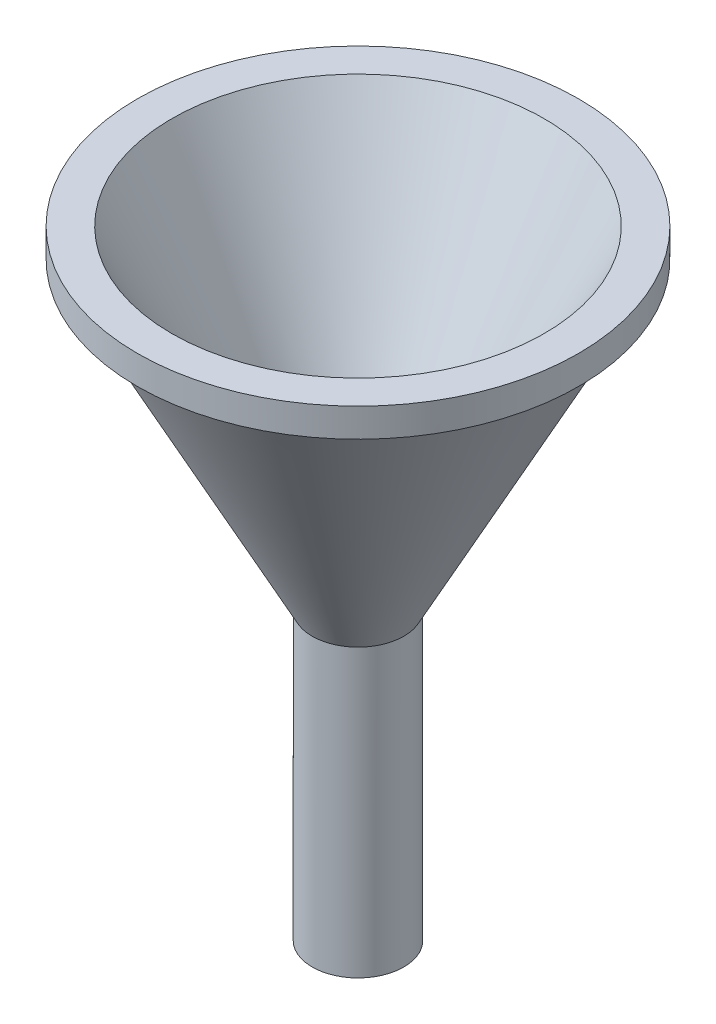
ISO-10303-21;
HEADER;
FILE_DESCRIPTION(('STEP AP214'),'2;1');
FILE_NAME('part.step','',(''),(''),'','','');
FILE_SCHEMA(('AUTOMOTIVE_DESIGN { 1 0 10303 214 1 1 1 1 }'));
ENDSEC;
DATA;
#1=APPLICATION_CONTEXT('core data for automotive mechanical design processes');
#2=APPLICATION_PROTOCOL_DEFINITION('international standard','automotive_design',2000,#1);
#3=PRODUCT_CONTEXT('',#1,'mechanical');
#4=PRODUCT('Part','Part','',(#3));
#5=PRODUCT_RELATED_PRODUCT_CATEGORY('part','',(#4));
#6=PRODUCT_DEFINITION_FORMATION('','',#4);
#7=PRODUCT_DEFINITION_CONTEXT('part definition',#1,'design');
#8=PRODUCT_DEFINITION('design','',#6,#7);
#9=PRODUCT_DEFINITION_SHAPE('','',#8);
#10=(LENGTH_UNIT() NAMED_UNIT(*) SI_UNIT(.MILLI.,.METRE.));
#11=(NAMED_UNIT(*) PLANE_ANGLE_UNIT() SI_UNIT($,.RADIAN.));
#12=(NAMED_UNIT(*) SI_UNIT($,.STERADIAN.) SOLID_ANGLE_UNIT());
#13=UNCERTAINTY_MEASURE_WITH_UNIT(LENGTH_MEASURE(1.E-05),#10,'distance_accuracy_value','');
#14=(GEOMETRIC_REPRESENTATION_CONTEXT(3) GLOBAL_UNCERTAINTY_ASSIGNED_CONTEXT((#13)) GLOBAL_UNIT_ASSIGNED_CONTEXT((#10,
#11,#12)) REPRESENTATION_CONTEXT('',''));
#15=CARTESIAN_POINT('',(0.,0.,0.));
#16=DIRECTION('',(0.,0.,1.));
#17=DIRECTION('',(1.,0.,0.));
#18=AXIS2_PLACEMENT_3D('',#15,#16,#17);
#19=CARTESIAN_POINT('',(0.,50.,0.));
#20=DIRECTION('',(0.,1.,0.));
#21=DIRECTION('',(0.,0.,1.));
#22=AXIS2_PLACEMENT_3D('',#19,#20,#21);
#23=CONICAL_SURFACE('',#22,8.00000000000001,0.484122563024974);
#24=CARTESIAN_POINT('',(0.,50.,0.));
#25=DIRECTION('',(0.,-1.,0.));
#26=DIRECTION('',(0.,0.,-1.));
#27=AXIS2_PLACEMENT_3D('',#24,#25,#26);
#28=CIRCLE('',#27,8.00000000000001);
#29=CARTESIAN_POINT('',(0.,50.,8.00000000000001));
#30=VERTEX_POINT('',#29);
#31=EDGE_CURVE('E65',#30,#30,#28,.T.);
#32=CARTESIAN_POINT('',(0.,103.,0.));
#33=DIRECTION('',(0.,1.,0.));
#34=DIRECTION('',(0.,0.,1.));
#35=AXIS2_PLACEMENT_3D('',#32,#33,#34);
#36=CIRCLE('',#35,35.8706896551724);
#37=CARTESIAN_POINT('',(0.,103.,35.8706896551724));
#38=VERTEX_POINT('',#37);
#39=EDGE_CURVE('E45',#38,#38,#36,.F.);
#40=CARTESIAN_POINT('',(0.,50.,8.00000000000001));
#41=CARTESIAN_POINT('',(0.,50.5520833333333,8.29031968390806));
#42=CARTESIAN_POINT('',(0.,51.1041666666667,8.5806393678161));
#43=CARTESIAN_POINT('',(0.,52.2083333333333,9.1612787356322));
#44=CARTESIAN_POINT('',(0.,52.7604166666667,9.45159841954024));
#45=CARTESIAN_POINT('',(0.,53.8645833333333,10.0322377873563));
#46=CARTESIAN_POINT('',(0.,54.4166666666667,10.3225574712644));
#47=CARTESIAN_POINT('',(0.,55.5208333333333,10.9031968390805));
#48=CARTESIAN_POINT('',(0.,56.0729166666667,11.1935165229885));
#49=CARTESIAN_POINT('',(0.,57.1770833333333,11.7741558908046));
#50=CARTESIAN_POINT('',(0.,57.7291666666667,12.0644755747127));
#51=CARTESIAN_POINT('',(0.,58.8333333333333,12.6451149425287));
#52=CARTESIAN_POINT('',(0.,59.3854166666667,12.9354346264368));
#53=CARTESIAN_POINT('',(0.,60.4895833333333,13.5160739942529));
#54=CARTESIAN_POINT('',(0.,61.0416666666667,13.8063936781609));
#55=CARTESIAN_POINT('',(0.,62.1458333333333,14.387033045977));
#56=CARTESIAN_POINT('',(0.,62.6979166666667,14.6773527298851));
#57=CARTESIAN_POINT('',(0.,63.8020833333333,15.2579920977012));
#58=CARTESIAN_POINT('',(0.,64.3541666666667,15.5483117816092));
#59=CARTESIAN_POINT('',(0.,65.4583333333333,16.1289511494253));
#60=CARTESIAN_POINT('',(0.,66.0104166666667,16.4192708333333));
#61=CARTESIAN_POINT('',(0.,67.1145833333333,16.9999102011494));
#62=CARTESIAN_POINT('',(0.,67.6666666666667,17.2902298850575));
#63=CARTESIAN_POINT('',(0.,68.7708333333333,17.8708692528736));
#64=CARTESIAN_POINT('',(0.,69.3229166666667,18.1611889367816));
#65=CARTESIAN_POINT('',(0.,70.4270833333333,18.7418283045977));
#66=CARTESIAN_POINT('',(0.,70.9791666666667,19.0321479885058));
#67=CARTESIAN_POINT('',(0.,72.0833333333333,19.6127873563218));
#68=CARTESIAN_POINT('',(0.,72.6354166666667,19.9031070402299));
#69=CARTESIAN_POINT('',(0.,73.7395833333333,20.483746408046));
#70=CARTESIAN_POINT('',(0.,74.2916666666667,20.774066091954));
#71=CARTESIAN_POINT('',(0.,75.3958333333333,21.3547054597701));
#72=CARTESIAN_POINT('',(0.,75.9479166666667,21.6450251436782));
#73=CARTESIAN_POINT('',(0.,77.0520833333333,22.2256645114943));
#74=CARTESIAN_POINT('',(0.,77.6041666666667,22.5159841954023));
#75=CARTESIAN_POINT('',(0.,78.7083333333333,23.0966235632184));
#76=CARTESIAN_POINT('',(0.,79.2604166666667,23.3869432471264));
#77=CARTESIAN_POINT('',(0.,80.3645833333333,23.9675826149425));
#78=CARTESIAN_POINT('',(0.,80.9166666666667,24.2579022988506));
#79=CARTESIAN_POINT('',(0.,82.0208333333333,24.8385416666667));
#80=CARTESIAN_POINT('',(0.,82.5729166666667,25.1288613505747));
#81=CARTESIAN_POINT('',(0.,83.6770833333333,25.7095007183908));
#82=CARTESIAN_POINT('',(0.,84.2291666666667,25.9998204022989));
#83=CARTESIAN_POINT('',(0.,85.3333333333333,26.5804597701149));
#84=CARTESIAN_POINT('',(0.,85.8854166666667,26.870779454023));
#85=CARTESIAN_POINT('',(0.,86.9895833333333,27.4514188218391));
#86=CARTESIAN_POINT('',(0.,87.5416666666667,27.7417385057471));
#87=CARTESIAN_POINT('',(0.,88.6458333333333,28.3223778735632));
#88=CARTESIAN_POINT('',(0.,89.1979166666667,28.6126975574713));
#89=CARTESIAN_POINT('',(0.,90.3020833333333,29.1933369252874));
#90=CARTESIAN_POINT('',(0.,90.8541666666667,29.4836566091954));
#91=CARTESIAN_POINT('',(0.,91.9583333333333,30.0642959770115));
#92=CARTESIAN_POINT('',(0.,92.5104166666667,30.3546156609195));
#93=CARTESIAN_POINT('',(0.,93.6145833333333,30.9352550287356));
#94=CARTESIAN_POINT('',(0.,94.1666666666667,31.2255747126437));
#95=CARTESIAN_POINT('',(0.,95.2708333333333,31.8062140804598));
#96=CARTESIAN_POINT('',(0.,95.8229166666667,32.0965337643678));
#97=CARTESIAN_POINT('',(0.,96.9270833333333,32.6771731321839));
#98=CARTESIAN_POINT('',(0.,97.4791666666667,32.9674928160919));
#99=CARTESIAN_POINT('',(0.,98.5833333333333,33.548132183908));
#100=CARTESIAN_POINT('',(0.,99.1354166666667,33.8384518678161));
#101=CARTESIAN_POINT('',(0.,100.239583333333,34.4190912356322));
#102=CARTESIAN_POINT('',(0.,100.791666666667,34.7094109195402));
#103=CARTESIAN_POINT('',(0.,101.895833333333,35.2900502873563));
#104=CARTESIAN_POINT('',(0.,102.447916666667,35.5803699712644));
#105=CARTESIAN_POINT('',(0.,103.,35.8706896551724));
#106=B_SPLINE_CURVE_WITH_KNOTS('',3,(#40,#41,#42,#43,#44,#45,#46,#47,#48,#49,#50,#51,#52,#53,
#54,#55,#56,#57,#58,#59,#60,#61,#62,#63,#64,#65,#66,#67,#68,#69,#70,#71,#72,#73,#74,#75,#76,#77,
#78,#79,#80,#81,#82,#83,#84,#85,#86,#87,#88,#89,#90,#91,#92,#93,#94,#95,#96,#97,#98,#99,#100,
#101,#102,#103,#104,#105),.UNSPECIFIED.,.F.,.F.,(4,2,2,2,2,2,2,2,2,2,2,2,2,2,2,2,2,2,2,2,2,2,2,
2,2,2,2,2,2,2,2,2,4),(0.,1.87129199546201,3.74258399092403,5.61387598638604,7.48516798184805,
9.35645997731007,11.2277519727721,13.0990439682341,14.9703359636961,16.8416279591581,
18.7129199546201,20.5842119500821,22.4555039455442,24.3267959410062,26.1980879364682,
28.0693799319302,29.9406719273922,31.8119639228542,33.6832559183162,35.5545479137783,
37.4258399092403,39.2971319047023,41.1684239001643,43.0397158956263,44.9110078910884,
46.7822998865504,48.6535918820124,50.5248838774744,52.3961758729364,54.2674678683984,
56.1387598638605,58.0100518593225,59.8813438547845),.UNSPECIFIED.);
#107=EDGE_CURVE('BSEAM41',#30,#38,#106,.T.);
#108=ORIENTED_EDGE('',*,*,#31,.F.);
#109=ORIENTED_EDGE('',*,*,#39,.T.);
#110=ORIENTED_EDGE('',*,*,#107,.T.);
#111=ORIENTED_EDGE('',*,*,#107,.F.);
#112=EDGE_LOOP('',(#108,#110,#109,#111));
#113=FACE_BOUND('',#112,.T.);
#114=ADVANCED_FACE('F41',(#113),#23,.T.);
#115=CARTESIAN_POINT('',(8.,0.,0.));
#116=DIRECTION('',(0.,-1.,0.));
#117=DIRECTION('',(0.,0.,-1.));
#118=AXIS2_PLACEMENT_3D('',#115,#116,#117);
#119=PLANE('',#118);
#120=CARTESIAN_POINT('',(0.,0.,0.));
#121=DIRECTION('',(0.,-1.,0.));
#122=DIRECTION('',(0.,0.,-1.));
#123=AXIS2_PLACEMENT_3D('',#120,#121,#122);
#124=CIRCLE('',#123,8.);
#125=CARTESIAN_POINT('',(0.,0.,-8.));
#126=VERTEX_POINT('',#125);
#127=EDGE_CURVE('E69',#126,#126,#124,.T.);
#128=ORIENTED_EDGE('',*,*,#127,.T.);
#129=EDGE_LOOP('',(#128));
#130=FACE_BOUND('',#129,.T.);
#131=CARTESIAN_POINT('',(0.,0.,0.));
#132=DIRECTION('',(0.,-1.,0.));
#133=DIRECTION('',(0.,0.,-1.));
#134=AXIS2_PLACEMENT_3D('',#131,#132,#133);
#135=CIRCLE('',#134,2.);
#136=CARTESIAN_POINT('',(0.,0.,-2.));
#137=VERTEX_POINT('',#136);
#138=EDGE_CURVE('E10',#137,#137,#135,.T.);
#139=ORIENTED_EDGE('',*,*,#138,.F.);
#140=EDGE_LOOP('',(#139));
#141=FACE_BOUND('',#140,.T.);
#142=ADVANCED_FACE('F43',(#130,#141),#119,.T.);
#143=CARTESIAN_POINT('',(0.,0.,0.));
#144=DIRECTION('',(0.,-1.,0.));
#145=DIRECTION('',(0.,0.,-1.));
#146=AXIS2_PLACEMENT_3D('',#143,#144,#145);
#147=CYLINDRICAL_SURFACE('',#146,2.00000000000001);
#148=ORIENTED_EDGE('',*,*,#138,.T.);
#149=EDGE_LOOP('',(#148));
#150=FACE_BOUND('',#149,.T.);
#151=CARTESIAN_POINT('',(0.,50.,0.));
#152=DIRECTION('',(0.,-1.,0.));
#153=DIRECTION('',(0.,0.,-1.));
#154=AXIS2_PLACEMENT_3D('',#151,#152,#153);
#155=CIRCLE('',#154,2.00000000000001);
#156=CARTESIAN_POINT('',(0.,50.,2.00000000000002));
#157=VERTEX_POINT('',#156);
#158=EDGE_CURVE('E50',#157,#157,#155,.T.);
#159=ORIENTED_EDGE('',*,*,#158,.F.);
#160=EDGE_LOOP('',(#159));
#161=FACE_BOUND('',#160,.T.);
#162=ADVANCED_FACE('F99',(#150,#161),#147,.F.);
#163=CARTESIAN_POINT('',(0.,108.,0.));
#164=DIRECTION('',(0.,1.,0.));
#165=DIRECTION('',(0.,0.,1.));
#166=AXIS2_PLACEMENT_3D('',#163,#164,#165);
#167=CONICAL_SURFACE('',#166,32.5,0.484122563024974);
#168=CARTESIAN_POINT('',(0.,108.,0.));
#169=DIRECTION('',(0.,-1.,0.));
#170=DIRECTION('',(0.,0.,-1.));
#171=AXIS2_PLACEMENT_3D('',#168,#169,#170);
#172=CIRCLE('',#171,32.5);
#173=CARTESIAN_POINT('',(0.,108.,32.5));
#174=VERTEX_POINT('',#173);
#175=EDGE_CURVE('E55',#174,#174,#172,.T.);
#176=CARTESIAN_POINT('',(0.,50.,2.00000000000002));
#177=CARTESIAN_POINT('',(0.,50.6041666666667,2.31770833333335));
#178=CARTESIAN_POINT('',(0.,51.2083333333333,2.63541666666669));
#179=CARTESIAN_POINT('',(0.,52.4166666666667,3.27083333333335));
#180=CARTESIAN_POINT('',(0.,53.0208333333333,3.58854166666668));
#181=CARTESIAN_POINT('',(0.,54.2291666666667,4.22395833333335));
#182=CARTESIAN_POINT('',(0.,54.8333333333333,4.54166666666668));
#183=CARTESIAN_POINT('',(0.,56.0416666666667,5.17708333333335));
#184=CARTESIAN_POINT('',(0.,56.6458333333333,5.49479166666668));
#185=CARTESIAN_POINT('',(0.,57.8541666666667,6.13020833333335));
#186=CARTESIAN_POINT('',(0.,58.4583333333333,6.44791666666668));
#187=CARTESIAN_POINT('',(0.,59.6666666666667,7.08333333333335));
#188=CARTESIAN_POINT('',(0.,60.2708333333333,7.40104166666668));
#189=CARTESIAN_POINT('',(0.,61.4791666666667,8.03645833333335));
#190=CARTESIAN_POINT('',(0.,62.0833333333333,8.35416666666668));
#191=CARTESIAN_POINT('',(0.,63.2916666666667,8.98958333333335));
#192=CARTESIAN_POINT('',(0.,63.8958333333333,9.30729166666668));
#193=CARTESIAN_POINT('',(0.,65.1041666666667,9.94270833333335));
#194=CARTESIAN_POINT('',(0.,65.7083333333333,10.2604166666667));
#195=CARTESIAN_POINT('',(0.,66.9166666666667,10.8958333333333));
#196=CARTESIAN_POINT('',(0.,67.5208333333333,11.2135416666667));
#197=CARTESIAN_POINT('',(0.,68.7291666666667,11.8489583333333));
#198=CARTESIAN_POINT('',(0.,69.3333333333333,12.1666666666667));
#199=CARTESIAN_POINT('',(0.,70.5416666666667,12.8020833333333));
#200=CARTESIAN_POINT('',(0.,71.1458333333333,13.1197916666667));
#201=CARTESIAN_POINT('',(0.,72.3541666666667,13.7552083333333));
#202=CARTESIAN_POINT('',(0.,72.9583333333333,14.0729166666667));
#203=CARTESIAN_POINT('',(0.,74.1666666666667,14.7083333333333));
#204=CARTESIAN_POINT('',(0.,74.7708333333333,15.0260416666667));
#205=CARTESIAN_POINT('',(0.,75.9791666666667,15.6614583333333));
#206=CARTESIAN_POINT('',(0.,76.5833333333334,15.9791666666667));
#207=CARTESIAN_POINT('',(0.,77.7916666666667,16.6145833333333));
#208=CARTESIAN_POINT('',(0.,78.3958333333333,16.9322916666667));
#209=CARTESIAN_POINT('',(0.,79.6041666666667,17.5677083333333));
#210=CARTESIAN_POINT('',(0.,80.2083333333333,17.8854166666667));
#211=CARTESIAN_POINT('',(0.,81.4166666666667,18.5208333333333));
#212=CARTESIAN_POINT('',(0.,82.0208333333333,18.8385416666667));
#213=CARTESIAN_POINT('',(0.,83.2291666666667,19.4739583333333));
#214=CARTESIAN_POINT('',(0.,83.8333333333333,19.7916666666667));
#215=CARTESIAN_POINT('',(0.,85.0416666666667,20.4270833333333));
#216=CARTESIAN_POINT('',(0.,85.6458333333333,20.7447916666667));
#217=CARTESIAN_POINT('',(0.,86.8541666666667,21.3802083333333));
#218=CARTESIAN_POINT('',(0.,87.4583333333333,21.6979166666667));
#219=CARTESIAN_POINT('',(0.,88.6666666666667,22.3333333333333));
#220=CARTESIAN_POINT('',(0.,89.2708333333333,22.6510416666667));
#221=CARTESIAN_POINT('',(0.,90.4791666666667,23.2864583333333));
#222=CARTESIAN_POINT('',(0.,91.0833333333333,23.6041666666667));
#223=CARTESIAN_POINT('',(0.,92.2916666666667,24.2395833333333));
#224=CARTESIAN_POINT('',(0.,92.8958333333333,24.5572916666667));
#225=CARTESIAN_POINT('',(0.,94.1041666666667,25.1927083333333));
#226=CARTESIAN_POINT('',(0.,94.7083333333333,25.5104166666667));
#227=CARTESIAN_POINT('',(0.,95.9166666666667,26.1458333333333));
#228=CARTESIAN_POINT('',(0.,96.5208333333333,26.4635416666667));
#229=CARTESIAN_POINT('',(0.,97.7291666666667,27.0989583333333));
#230=CARTESIAN_POINT('',(0.,98.3333333333333,27.4166666666667));
#231=CARTESIAN_POINT('',(0.,99.5416666666667,28.0520833333333));
#232=CARTESIAN_POINT('',(0.,100.145833333333,28.3697916666667));
#233=CARTESIAN_POINT('',(0.,101.354166666667,29.0052083333333));
#234=CARTESIAN_POINT('',(0.,101.958333333333,29.3229166666667));
#235=CARTESIAN_POINT('',(0.,103.166666666667,29.9583333333333));
#236=CARTESIAN_POINT('',(0.,103.770833333333,30.2760416666667));
#237=CARTESIAN_POINT('',(0.,104.979166666667,30.9114583333333));
#238=CARTESIAN_POINT('',(0.,105.583333333333,31.2291666666667));
#239=CARTESIAN_POINT('',(0.,106.791666666667,31.8645833333333));
#240=CARTESIAN_POINT('',(0.,107.395833333333,32.1822916666667));
#241=CARTESIAN_POINT('',(0.,108.,32.5));
#242=B_SPLINE_CURVE_WITH_KNOTS('',3,(#176,#177,#178,#179,#180,#181,#182,#183,#184,#185,#186,
#187,#188,#189,#190,#191,#192,#193,#194,#195,#196,#197,#198,#199,#200,#201,#202,#203,#204,#205,
#206,#207,#208,#209,#210,#211,#212,#213,#214,#215,#216,#217,#218,#219,#220,#221,#222,#223,#224,
#225,#226,#227,#228,#229,#230,#231,#232,#233,#234,#235,#236,#237,#238,#239,#240,#241),
.UNSPECIFIED.,.F.,.F.,(4,2,2,2,2,2,2,2,2,2,2,2,2,2,2,2,2,2,2,2,2,2,2,2,2,2,2,2,2,2,2,2,4),(0.,
2.04782897616598,4.09565795233195,6.14348692849793,8.19131590466391,10.2391448808299,
12.2869738569959,14.3348028331618,16.3826318093278,18.4304607854938,20.4782897616598,
22.5261187378258,24.5739477139917,26.6217766901577,28.6696056663237,30.7174346424897,
32.7652636186556,34.8130925948216,36.8609215709876,38.9087505471536,40.9565795233196,
43.0044084994855,45.0522374756515,47.1000664518175,49.1478954279835,51.1957244041495,
53.2435533803154,55.2913823564814,57.3392113326474,59.3870403088134,61.4348692849793,
63.4826982611453,65.5305272373113),.UNSPECIFIED.);
#243=EDGE_CURVE('BSEAM107',#157,#174,#242,.T.);
#244=ORIENTED_EDGE('',*,*,#158,.T.);
#245=ORIENTED_EDGE('',*,*,#175,.F.);
#246=ORIENTED_EDGE('',*,*,#243,.T.);
#247=ORIENTED_EDGE('',*,*,#243,.F.);
#248=EDGE_LOOP('',(#244,#246,#245,#247));
#249=FACE_BOUND('',#248,.T.);
#250=ADVANCED_FACE('F107',(#249),#167,.F.);
#251=CARTESIAN_POINT('',(32.5,108.,0.));
#252=DIRECTION('',(0.,1.,0.));
#253=DIRECTION('',(0.,0.,1.));
#254=AXIS2_PLACEMENT_3D('',#251,#252,#253);
#255=PLANE('',#254);
#256=ORIENTED_EDGE('',*,*,#175,.T.);
#257=EDGE_LOOP('',(#256));
#258=FACE_BOUND('',#257,.T.);
#259=CARTESIAN_POINT('',(0.,108.,0.));
#260=DIRECTION('',(0.,-1.,0.));
#261=DIRECTION('',(0.,0.,-1.));
#262=AXIS2_PLACEMENT_3D('',#259,#260,#261);
#263=CIRCLE('',#262,38.5);
#264=CARTESIAN_POINT('',(0.,108.,-38.5));
#265=VERTEX_POINT('',#264);
#266=EDGE_CURVE('E61',#265,#265,#263,.T.);
#267=ORIENTED_EDGE('',*,*,#266,.F.);
#268=EDGE_LOOP('',(#267));
#269=FACE_BOUND('',#268,.T.);
#270=ADVANCED_FACE('F104',(#258,#269),#255,.T.);
#271=CARTESIAN_POINT('',(0.,0.,0.));
#272=DIRECTION('',(0.,-1.,0.));
#273=DIRECTION('',(0.,0.,-1.));
#274=AXIS2_PLACEMENT_3D('',#271,#272,#273);
#275=CYLINDRICAL_SURFACE('',#274,8.00000000000001);
#276=ORIENTED_EDGE('',*,*,#31,.T.);
#277=EDGE_LOOP('',(#276));
#278=FACE_BOUND('',#277,.T.);
#279=ORIENTED_EDGE('',*,*,#127,.F.);
#280=EDGE_LOOP('',(#279));
#281=FACE_BOUND('',#280,.T.);
#282=ADVANCED_FACE('F91',(#278,#281),#275,.T.);
#283=CARTESIAN_POINT('',(0.,103.,0.));
#284=DIRECTION('',(0.,1.,0.));
#285=DIRECTION('',(0.,0.,1.));
#286=AXIS2_PLACEMENT_3D('',#283,#284,#285);
#287=CYLINDRICAL_SURFACE('',#286,38.5);
#288=CARTESIAN_POINT('',(0.,103.,0.));
#289=DIRECTION('',(0.,1.,0.));
#290=DIRECTION('',(0.,0.,1.));
#291=AXIS2_PLACEMENT_3D('',#288,#289,#290);
#292=CIRCLE('',#291,38.5);
#293=CARTESIAN_POINT('',(0.,103.,38.5));
#294=VERTEX_POINT('',#293);
#295=EDGE_CURVE('E73',#294,#294,#292,.T.);
#296=ORIENTED_EDGE('',*,*,#295,.T.);
#297=EDGE_LOOP('',(#296));
#298=FACE_BOUND('',#297,.T.);
#299=ORIENTED_EDGE('',*,*,#266,.T.);
#300=EDGE_LOOP('',(#299));
#301=FACE_BOUND('',#300,.T.);
#302=ADVANCED_FACE('F86',(#298,#301),#287,.T.);
#303=CARTESIAN_POINT('',(0.,103.,0.));
#304=DIRECTION('',(0.,1.,0.));
#305=DIRECTION('',(0.,0.,1.));
#306=AXIS2_PLACEMENT_3D('',#303,#304,#305);
#307=PLANE('',#306);
#308=ORIENTED_EDGE('',*,*,#39,.F.);
#309=EDGE_LOOP('',(#308));
#310=FACE_BOUND('',#309,.T.);
#311=ORIENTED_EDGE('',*,*,#295,.F.);
#312=EDGE_LOOP('',(#311));
#313=FACE_BOUND('',#312,.T.);
#314=ADVANCED_FACE('F83',(#310,#313),#307,.F.);
#315=CLOSED_SHELL('',(#114,#142,#162,#250,#270,#282,#302,#314));
#316=MANIFOLD_SOLID_BREP('B2',#315);
#317=ADVANCED_BREP_SHAPE_REPRESENTATION('',(#18,#316),#14);
#318=SHAPE_DEFINITION_REPRESENTATION(#9,#317);
ENDSEC;
END-ISO-10303-21;
